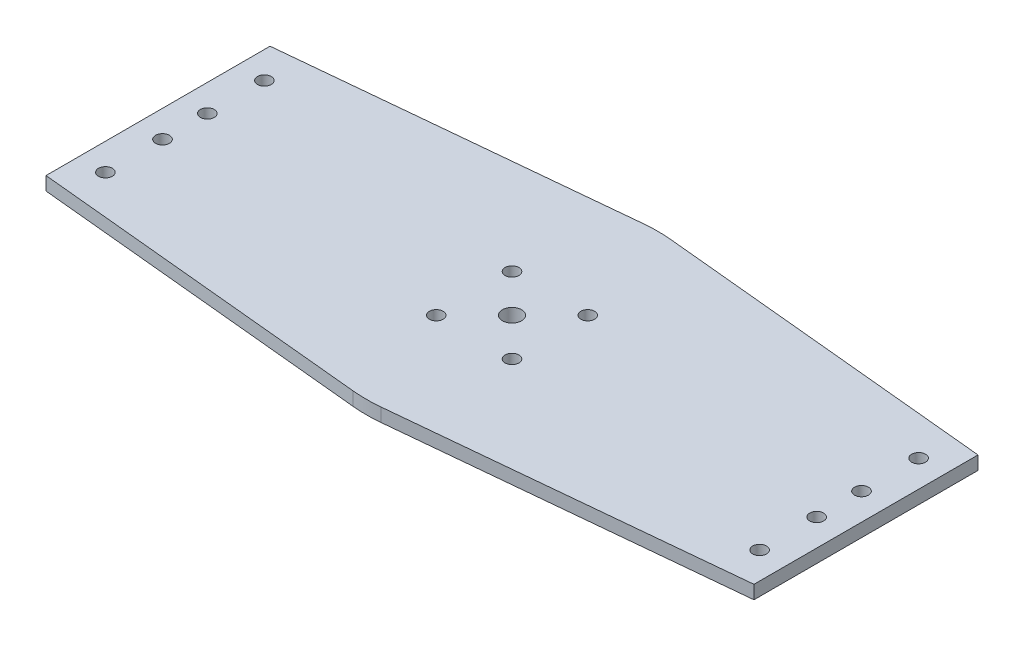
ISO-10303-21;
HEADER;
FILE_DESCRIPTION(('STEP AP214'),'2;1');
FILE_NAME('part.step','',(''),(''),'','','');
FILE_SCHEMA(('AUTOMOTIVE_DESIGN { 1 0 10303 214 1 1 1 1 }'));
ENDSEC;
DATA;
#1=APPLICATION_CONTEXT('core data for automotive mechanical design processes');
#2=APPLICATION_PROTOCOL_DEFINITION('international standard','automotive_design',2000,#1);
#3=PRODUCT_CONTEXT('',#1,'mechanical');
#4=PRODUCT('Part','Part','',(#3));
#5=PRODUCT_RELATED_PRODUCT_CATEGORY('part','',(#4));
#6=PRODUCT_DEFINITION_FORMATION('','',#4);
#7=PRODUCT_DEFINITION_CONTEXT('part definition',#1,'design');
#8=PRODUCT_DEFINITION('design','',#6,#7);
#9=PRODUCT_DEFINITION_SHAPE('','',#8);
#10=(LENGTH_UNIT() NAMED_UNIT(*) SI_UNIT(.MILLI.,.METRE.));
#11=(NAMED_UNIT(*) PLANE_ANGLE_UNIT() SI_UNIT($,.RADIAN.));
#12=(NAMED_UNIT(*) SI_UNIT($,.STERADIAN.) SOLID_ANGLE_UNIT());
#13=UNCERTAINTY_MEASURE_WITH_UNIT(LENGTH_MEASURE(1.E-05),#10,'distance_accuracy_value','');
#14=(GEOMETRIC_REPRESENTATION_CONTEXT(3) GLOBAL_UNCERTAINTY_ASSIGNED_CONTEXT((#13)) GLOBAL_UNIT_ASSIGNED_CONTEXT((#10,
#11,#12)) REPRESENTATION_CONTEXT('',''));
#15=CARTESIAN_POINT('',(0.,0.,0.));
#16=DIRECTION('',(0.,0.,1.));
#17=DIRECTION('',(1.,0.,0.));
#18=AXIS2_PLACEMENT_3D('',#15,#16,#17);
#19=CARTESIAN_POINT('',(0.,3.,0.));
#20=DIRECTION('',(0.,-1.,0.));
#21=DIRECTION('',(0.,0.,-1.));
#22=AXIS2_PLACEMENT_3D('',#19,#20,#21);
#23=CYLINDRICAL_SURFACE('',#22,32.5);
#24=CARTESIAN_POINT('',(0.,0.,0.));
#25=DIRECTION('',(0.,1.,0.));
#26=DIRECTION('',(0.,0.,1.));
#27=AXIS2_PLACEMENT_3D('',#24,#25,#26);
#28=CIRCLE('',#27,32.5);
#29=CARTESIAN_POINT('',(3.13335358237981,0.,-32.3486026796798));
#30=VERTEX_POINT('',#29);
#31=CARTESIAN_POINT('',(-3.13335358237981,0.,-32.3486026796798));
#32=VERTEX_POINT('',#31);
#33=EDGE_CURVE('E130',#30,#32,#28,.T.);
#34=ORIENTED_EDGE('',*,*,#33,.T.);
#35=DIRECTION('',(0.,-1.,0.));
#36=VECTOR('',#35,1.);
#37=CARTESIAN_POINT('',(-3.13335358237981,3.,-32.3486026796798));
#38=LINE('',#37,#36);
#39=CARTESIAN_POINT('',(-3.13335358237981,3.,-32.3486026796798));
#40=VERTEX_POINT('',#39);
#41=EDGE_CURVE('E11',#40,#32,#38,.T.);
#42=ORIENTED_EDGE('',*,*,#41,.F.);
#43=CARTESIAN_POINT('',(0.,3.,0.));
#44=DIRECTION('',(0.,1.,0.));
#45=DIRECTION('',(0.,0.,1.));
#46=AXIS2_PLACEMENT_3D('',#43,#44,#45);
#47=CIRCLE('',#46,32.5);
#48=CARTESIAN_POINT('',(3.13335358237981,3.,-32.3486026796798));
#49=VERTEX_POINT('',#48);
#50=EDGE_CURVE('E145',#49,#40,#47,.T.);
#51=ORIENTED_EDGE('',*,*,#50,.F.);
#52=DIRECTION('',(0.,-1.,0.));
#53=VECTOR('',#52,1.);
#54=CARTESIAN_POINT('',(3.13335358237981,3.,-32.3486026796798));
#55=LINE('',#54,#53);
#56=EDGE_CURVE('E126',#49,#30,#55,.T.);
#57=ORIENTED_EDGE('',*,*,#56,.T.);
#58=EDGE_LOOP('',(#34,#42,#51,#57));
#59=FACE_BOUND('',#58,.T.);
#60=ADVANCED_FACE('F34',(#59),#23,.T.);
#61=CARTESIAN_POINT('',(-79.,3.,-25.));
#62=DIRECTION('',(0.0964108794578403,0.,0.995341620913225));
#63=DIRECTION('',(0.995341620913225,0.,-0.0964108794578403));
#64=AXIS2_PLACEMENT_3D('',#61,#62,#63);
#65=PLANE('',#64);
#66=DIRECTION('',(-0.995341620913225,0.,0.0964108794578404));
#67=VECTOR('',#66,1.);
#68=CARTESIAN_POINT('',(-79.,0.,-25.));
#69=LINE('',#68,#67);
#70=CARTESIAN_POINT('',(-79.,0.,-25.));
#71=VERTEX_POINT('',#70);
#72=EDGE_CURVE('E133',#32,#71,#69,.T.);
#73=ORIENTED_EDGE('',*,*,#72,.T.);
#74=DIRECTION('',(0.,-1.,0.));
#75=VECTOR('',#74,1.);
#76=CARTESIAN_POINT('',(-79.,3.,-25.));
#77=LINE('',#76,#75);
#78=CARTESIAN_POINT('',(-79.,3.,-25.));
#79=VERTEX_POINT('',#78);
#80=EDGE_CURVE('E42',#79,#71,#77,.T.);
#81=ORIENTED_EDGE('',*,*,#80,.F.);
#82=DIRECTION('',(-0.995341620913225,0.,0.0964108794578404));
#83=VECTOR('',#82,1.);
#84=CARTESIAN_POINT('',(-79.,3.,-25.));
#85=LINE('',#84,#83);
#86=EDGE_CURVE('E93',#40,#79,#85,.T.);
#87=ORIENTED_EDGE('',*,*,#86,.F.);
#88=ORIENTED_EDGE('',*,*,#41,.T.);
#89=EDGE_LOOP('',(#73,#81,#87,#88));
#90=FACE_BOUND('',#89,.T.);
#91=ADVANCED_FACE('F271',(#90),#65,.F.);
#92=CARTESIAN_POINT('',(-79.,3.,-25.));
#93=DIRECTION('',(1.,0.,0.));
#94=DIRECTION('',(0.,0.,-1.));
#95=AXIS2_PLACEMENT_3D('',#92,#93,#94);
#96=PLANE('',#95);
#97=DIRECTION('',(0.,0.,1.));
#98=VECTOR('',#97,1.);
#99=CARTESIAN_POINT('',(-79.,0.,-25.));
#100=LINE('',#99,#98);
#101=CARTESIAN_POINT('',(-79.,0.,25.));
#102=VERTEX_POINT('',#101);
#103=EDGE_CURVE('E136',#71,#102,#100,.T.);
#104=ORIENTED_EDGE('',*,*,#103,.T.);
#105=DIRECTION('',(0.,-1.,0.));
#106=VECTOR('',#105,1.);
#107=CARTESIAN_POINT('',(-79.,3.,25.));
#108=LINE('',#107,#106);
#109=CARTESIAN_POINT('',(-79.,3.,25.));
#110=VERTEX_POINT('',#109);
#111=EDGE_CURVE('E152',#110,#102,#108,.T.);
#112=ORIENTED_EDGE('',*,*,#111,.F.);
#113=DIRECTION('',(0.,0.,1.));
#114=VECTOR('',#113,1.);
#115=CARTESIAN_POINT('',(-79.,3.,-25.));
#116=LINE('',#115,#114);
#117=EDGE_CURVE('E160',#79,#110,#116,.T.);
#118=ORIENTED_EDGE('',*,*,#117,.F.);
#119=ORIENTED_EDGE('',*,*,#80,.T.);
#120=EDGE_LOOP('',(#104,#112,#118,#119));
#121=FACE_BOUND('',#120,.T.);
#122=ADVANCED_FACE('F158',(#121),#96,.F.);
#123=CARTESIAN_POINT('',(-79.,3.,25.));
#124=DIRECTION('',(0.0964108794578402,0.,-0.995341620913225));
#125=DIRECTION('',(-0.995341620913225,0.,-0.0964108794578402));
#126=AXIS2_PLACEMENT_3D('',#123,#124,#125);
#127=PLANE('',#126);
#128=DIRECTION('',(0.995341620913225,0.,0.0964108794578402));
#129=VECTOR('',#128,1.);
#130=CARTESIAN_POINT('',(-79.,0.,25.));
#131=LINE('',#130,#129);
#132=CARTESIAN_POINT('',(-3.13335358237981,0.,32.3486026796798));
#133=VERTEX_POINT('',#132);
#134=EDGE_CURVE('E138',#102,#133,#131,.T.);
#135=ORIENTED_EDGE('',*,*,#134,.T.);
#136=DIRECTION('',(0.,-1.,0.));
#137=VECTOR('',#136,1.);
#138=CARTESIAN_POINT('',(-3.13335358237981,3.,32.3486026796798));
#139=LINE('',#138,#137);
#140=CARTESIAN_POINT('',(-3.13335358237981,3.,32.3486026796798));
#141=VERTEX_POINT('',#140);
#142=EDGE_CURVE('E149',#141,#133,#139,.T.);
#143=ORIENTED_EDGE('',*,*,#142,.F.);
#144=DIRECTION('',(0.995341620913225,0.,0.0964108794578402));
#145=VECTOR('',#144,1.);
#146=CARTESIAN_POINT('',(-79.,3.,25.));
#147=LINE('',#146,#145);
#148=EDGE_CURVE('E172',#110,#141,#147,.T.);
#149=ORIENTED_EDGE('',*,*,#148,.F.);
#150=ORIENTED_EDGE('',*,*,#111,.T.);
#151=EDGE_LOOP('',(#135,#143,#149,#150));
#152=FACE_BOUND('',#151,.T.);
#153=ADVANCED_FACE('F168',(#152),#127,.F.);
#154=CARTESIAN_POINT('',(0.,3.,0.));
#155=DIRECTION('',(0.,-1.,0.));
#156=DIRECTION('',(0.,0.,-1.));
#157=AXIS2_PLACEMENT_3D('',#154,#155,#156);
#158=CYLINDRICAL_SURFACE('',#157,32.5);
#159=CARTESIAN_POINT('',(0.,0.,0.));
#160=DIRECTION('',(0.,1.,0.));
#161=DIRECTION('',(0.,0.,1.));
#162=AXIS2_PLACEMENT_3D('',#159,#160,#161);
#163=CIRCLE('',#162,32.5);
#164=CARTESIAN_POINT('',(3.1333535823798,0.,32.3486026796798));
#165=VERTEX_POINT('',#164);
#166=EDGE_CURVE('E140',#133,#165,#163,.T.);
#167=ORIENTED_EDGE('',*,*,#166,.T.);
#168=DIRECTION('',(0.,-1.,0.));
#169=VECTOR('',#168,1.);
#170=CARTESIAN_POINT('',(3.1333535823798,3.,32.3486026796798));
#171=LINE('',#170,#169);
#172=CARTESIAN_POINT('',(3.1333535823798,3.,32.3486026796798));
#173=VERTEX_POINT('',#172);
#174=EDGE_CURVE('E121',#173,#165,#171,.T.);
#175=ORIENTED_EDGE('',*,*,#174,.F.);
#176=CARTESIAN_POINT('',(0.,3.,0.));
#177=DIRECTION('',(0.,1.,0.));
#178=DIRECTION('',(0.,0.,1.));
#179=AXIS2_PLACEMENT_3D('',#176,#177,#178);
#180=CIRCLE('',#179,32.5);
#181=EDGE_CURVE('E112',#141,#173,#180,.T.);
#182=ORIENTED_EDGE('',*,*,#181,.F.);
#183=ORIENTED_EDGE('',*,*,#142,.T.);
#184=EDGE_LOOP('',(#167,#175,#182,#183));
#185=FACE_BOUND('',#184,.T.);
#186=ADVANCED_FACE('F171',(#185),#158,.T.);
#187=CARTESIAN_POINT('',(79.,3.,25.));
#188=DIRECTION('',(-0.0964108794578402,0.,-0.995341620913225));
#189=DIRECTION('',(-0.995341620913225,0.,0.0964108794578402));
#190=AXIS2_PLACEMENT_3D('',#187,#188,#189);
#191=PLANE('',#190);
#192=DIRECTION('',(0.995341620913225,0.,-0.0964108794578402));
#193=VECTOR('',#192,1.);
#194=CARTESIAN_POINT('',(79.,0.,25.));
#195=LINE('',#194,#193);
#196=CARTESIAN_POINT('',(79.,0.,25.));
#197=VERTEX_POINT('',#196);
#198=EDGE_CURVE('E120',#165,#197,#195,.T.);
#199=ORIENTED_EDGE('',*,*,#198,.T.);
#200=DIRECTION('',(0.,-1.,0.));
#201=VECTOR('',#200,1.);
#202=CARTESIAN_POINT('',(79.,3.,25.));
#203=LINE('',#202,#201);
#204=CARTESIAN_POINT('',(79.,3.,25.));
#205=VERTEX_POINT('',#204);
#206=EDGE_CURVE('E117',#205,#197,#203,.T.);
#207=ORIENTED_EDGE('',*,*,#206,.F.);
#208=DIRECTION('',(0.995341620913225,0.,-0.0964108794578402));
#209=VECTOR('',#208,1.);
#210=CARTESIAN_POINT('',(79.,3.,25.));
#211=LINE('',#210,#209);
#212=EDGE_CURVE('E106',#173,#205,#211,.T.);
#213=ORIENTED_EDGE('',*,*,#212,.F.);
#214=ORIENTED_EDGE('',*,*,#174,.T.);
#215=EDGE_LOOP('',(#199,#207,#213,#214));
#216=FACE_BOUND('',#215,.T.);
#217=ADVANCED_FACE('F118',(#216),#191,.F.);
#218=CARTESIAN_POINT('',(79.,3.,-25.));
#219=DIRECTION('',(-1.,0.,0.));
#220=DIRECTION('',(0.,0.,1.));
#221=AXIS2_PLACEMENT_3D('',#218,#219,#220);
#222=PLANE('',#221);
#223=DIRECTION('',(0.,0.,-1.));
#224=VECTOR('',#223,1.);
#225=CARTESIAN_POINT('',(79.,0.,-25.));
#226=LINE('',#225,#224);
#227=CARTESIAN_POINT('',(79.,0.,-25.));
#228=VERTEX_POINT('',#227);
#229=EDGE_CURVE('E79',#197,#228,#226,.T.);
#230=ORIENTED_EDGE('',*,*,#229,.T.);
#231=DIRECTION('',(0.,-1.,0.));
#232=VECTOR('',#231,1.);
#233=CARTESIAN_POINT('',(79.,3.,-25.));
#234=LINE('',#233,#232);
#235=CARTESIAN_POINT('',(79.,3.,-25.));
#236=VERTEX_POINT('',#235);
#237=EDGE_CURVE('E122',#236,#228,#234,.T.);
#238=ORIENTED_EDGE('',*,*,#237,.F.);
#239=DIRECTION('',(0.,0.,-1.));
#240=VECTOR('',#239,1.);
#241=CARTESIAN_POINT('',(79.,3.,-25.));
#242=LINE('',#241,#240);
#243=EDGE_CURVE('E110',#205,#236,#242,.T.);
#244=ORIENTED_EDGE('',*,*,#243,.F.);
#245=ORIENTED_EDGE('',*,*,#206,.T.);
#246=EDGE_LOOP('',(#230,#238,#244,#245));
#247=FACE_BOUND('',#246,.T.);
#248=ADVANCED_FACE('F124',(#247),#222,.F.);
#249=CARTESIAN_POINT('',(79.,3.,-25.));
#250=DIRECTION('',(-0.0964108794578402,0.,0.995341620913225));
#251=DIRECTION('',(0.995341620913225,0.,0.0964108794578402));
#252=AXIS2_PLACEMENT_3D('',#249,#250,#251);
#253=PLANE('',#252);
#254=DIRECTION('',(-0.995341620913225,0.,-0.0964108794578403));
#255=VECTOR('',#254,1.);
#256=CARTESIAN_POINT('',(79.,0.,-25.));
#257=LINE('',#256,#255);
#258=EDGE_CURVE('E85',#228,#30,#257,.T.);
#259=ORIENTED_EDGE('',*,*,#258,.T.);
#260=ORIENTED_EDGE('',*,*,#56,.F.);
#261=DIRECTION('',(-0.995341620913225,0.,-0.0964108794578403));
#262=VECTOR('',#261,1.);
#263=CARTESIAN_POINT('',(79.,3.,-25.));
#264=LINE('',#263,#262);
#265=EDGE_CURVE('E50',#236,#49,#264,.T.);
#266=ORIENTED_EDGE('',*,*,#265,.F.);
#267=ORIENTED_EDGE('',*,*,#237,.T.);
#268=EDGE_LOOP('',(#259,#260,#266,#267));
#269=FACE_BOUND('',#268,.T.);
#270=ADVANCED_FACE('F278',(#269),#253,.F.);
#271=CARTESIAN_POINT('',(0.,3.,0.));
#272=DIRECTION('',(0.,1.,0.));
#273=DIRECTION('',(0.,0.,1.));
#274=AXIS2_PLACEMENT_3D('',#271,#272,#273);
#275=PLANE('',#274);
#276=CARTESIAN_POINT('',(73.,3.,5.));
#277=DIRECTION('',(0.,1.,0.));
#278=DIRECTION('',(0.,0.,1.));
#279=AXIS2_PLACEMENT_3D('',#276,#277,#278);
#280=CIRCLE('',#279,1.54999999999999);
#281=CARTESIAN_POINT('',(73.,3.,6.55));
#282=VERTEX_POINT('',#281);
#283=EDGE_CURVE('E237',#282,#282,#280,.F.);
#284=ORIENTED_EDGE('',*,*,#283,.T.);
#285=EDGE_LOOP('',(#284));
#286=FACE_BOUND('',#285,.T.);
#287=CARTESIAN_POINT('',(73.,3.,-5.));
#288=DIRECTION('',(0.,1.,0.));
#289=DIRECTION('',(0.,0.,1.));
#290=AXIS2_PLACEMENT_3D('',#287,#288,#289);
#291=CIRCLE('',#290,1.54999999999999);
#292=CARTESIAN_POINT('',(73.,3.,-3.45000000000001));
#293=VERTEX_POINT('',#292);
#294=EDGE_CURVE('E240',#293,#293,#291,.F.);
#295=ORIENTED_EDGE('',*,*,#294,.T.);
#296=EDGE_LOOP('',(#295));
#297=FACE_BOUND('',#296,.T.);
#298=CARTESIAN_POINT('',(73.,3.,-17.74));
#299=DIRECTION('',(0.,1.,0.));
#300=DIRECTION('',(0.,0.,1.));
#301=AXIS2_PLACEMENT_3D('',#298,#299,#300);
#302=CIRCLE('',#301,1.54999999999999);
#303=CARTESIAN_POINT('',(73.,3.,-16.19));
#304=VERTEX_POINT('',#303);
#305=EDGE_CURVE('E243',#304,#304,#302,.F.);
#306=ORIENTED_EDGE('',*,*,#305,.T.);
#307=EDGE_LOOP('',(#306));
#308=FACE_BOUND('',#307,.T.);
#309=CARTESIAN_POINT('',(73.,3.,17.74));
#310=DIRECTION('',(0.,1.,0.));
#311=DIRECTION('',(0.,0.,1.));
#312=AXIS2_PLACEMENT_3D('',#309,#310,#311);
#313=CIRCLE('',#312,1.54999999999999);
#314=CARTESIAN_POINT('',(73.,3.,19.29));
#315=VERTEX_POINT('',#314);
#316=EDGE_CURVE('E227',#315,#315,#313,.F.);
#317=ORIENTED_EDGE('',*,*,#316,.T.);
#318=EDGE_LOOP('',(#317));
#319=FACE_BOUND('',#318,.T.);
#320=CARTESIAN_POINT('',(-73.,3.,5.));
#321=DIRECTION('',(0.,1.,0.));
#322=DIRECTION('',(0.,0.,1.));
#323=AXIS2_PLACEMENT_3D('',#320,#321,#322);
#324=CIRCLE('',#323,1.54999999999999);
#325=CARTESIAN_POINT('',(-73.,3.,6.55));
#326=VERTEX_POINT('',#325);
#327=EDGE_CURVE('E213',#326,#326,#324,.T.);
#328=ORIENTED_EDGE('',*,*,#327,.F.);
#329=EDGE_LOOP('',(#328));
#330=FACE_BOUND('',#329,.T.);
#331=CARTESIAN_POINT('',(-73.,3.,-5.));
#332=DIRECTION('',(0.,1.,0.));
#333=DIRECTION('',(0.,0.,1.));
#334=AXIS2_PLACEMENT_3D('',#331,#332,#333);
#335=CIRCLE('',#334,1.54999999999999);
#336=CARTESIAN_POINT('',(-73.,3.,-3.45000000000001));
#337=VERTEX_POINT('',#336);
#338=EDGE_CURVE('E216',#337,#337,#335,.T.);
#339=ORIENTED_EDGE('',*,*,#338,.F.);
#340=EDGE_LOOP('',(#339));
#341=FACE_BOUND('',#340,.T.);
#342=CARTESIAN_POINT('',(-73.,3.,-17.74));
#343=DIRECTION('',(0.,1.,0.));
#344=DIRECTION('',(0.,0.,1.));
#345=AXIS2_PLACEMENT_3D('',#342,#343,#344);
#346=CIRCLE('',#345,1.54999999999999);
#347=CARTESIAN_POINT('',(-73.,3.,-16.19));
#348=VERTEX_POINT('',#347);
#349=EDGE_CURVE('E219',#348,#348,#346,.T.);
#350=ORIENTED_EDGE('',*,*,#349,.F.);
#351=EDGE_LOOP('',(#350));
#352=FACE_BOUND('',#351,.T.);
#353=CARTESIAN_POINT('',(-73.,3.,17.74));
#354=DIRECTION('',(0.,1.,0.));
#355=DIRECTION('',(0.,0.,1.));
#356=AXIS2_PLACEMENT_3D('',#353,#354,#355);
#357=CIRCLE('',#356,1.54999999999999);
#358=CARTESIAN_POINT('',(-73.,3.,19.29));
#359=VERTEX_POINT('',#358);
#360=EDGE_CURVE('E188',#359,#359,#357,.T.);
#361=ORIENTED_EDGE('',*,*,#360,.F.);
#362=EDGE_LOOP('',(#361));
#363=FACE_BOUND('',#362,.T.);
#364=CARTESIAN_POINT('',(8.45,3.,-8.45));
#365=DIRECTION('',(0.,1.,0.));
#366=DIRECTION('',(0.,0.,1.));
#367=AXIS2_PLACEMENT_3D('',#364,#365,#366);
#368=CIRCLE('',#367,1.55);
#369=CARTESIAN_POINT('',(8.45,3.,-6.9));
#370=VERTEX_POINT('',#369);
#371=EDGE_CURVE('E203',#370,#370,#368,.T.);
#372=ORIENTED_EDGE('',*,*,#371,.F.);
#373=EDGE_LOOP('',(#372));
#374=FACE_BOUND('',#373,.T.);
#375=CARTESIAN_POINT('',(8.45,3.,8.45));
#376=DIRECTION('',(0.,1.,0.));
#377=DIRECTION('',(0.,0.,1.));
#378=AXIS2_PLACEMENT_3D('',#375,#376,#377);
#379=CIRCLE('',#378,1.55);
#380=CARTESIAN_POINT('',(8.45,3.,9.99999999999999));
#381=VERTEX_POINT('',#380);
#382=EDGE_CURVE('E197',#381,#381,#379,.T.);
#383=ORIENTED_EDGE('',*,*,#382,.F.);
#384=EDGE_LOOP('',(#383));
#385=FACE_BOUND('',#384,.T.);
#386=CARTESIAN_POINT('',(-8.45,3.,8.45));
#387=DIRECTION('',(0.,1.,0.));
#388=DIRECTION('',(0.,0.,1.));
#389=AXIS2_PLACEMENT_3D('',#386,#387,#388);
#390=CIRCLE('',#389,1.55);
#391=CARTESIAN_POINT('',(-8.45,3.,10.));
#392=VERTEX_POINT('',#391);
#393=EDGE_CURVE('E191',#392,#392,#390,.T.);
#394=ORIENTED_EDGE('',*,*,#393,.F.);
#395=EDGE_LOOP('',(#394));
#396=FACE_BOUND('',#395,.T.);
#397=CARTESIAN_POINT('',(0.,3.,0.));
#398=DIRECTION('',(0.,1.,0.));
#399=DIRECTION('',(0.,0.,1.));
#400=AXIS2_PLACEMENT_3D('',#397,#398,#399);
#401=CIRCLE('',#400,2.15);
#402=CARTESIAN_POINT('',(0.,3.,2.14999999999999));
#403=VERTEX_POINT('',#402);
#404=EDGE_CURVE('E184',#403,#403,#401,.T.);
#405=ORIENTED_EDGE('',*,*,#404,.F.);
#406=EDGE_LOOP('',(#405));
#407=FACE_BOUND('',#406,.T.);
#408=CARTESIAN_POINT('',(-8.45,3.,-8.45));
#409=DIRECTION('',(0.,1.,0.));
#410=DIRECTION('',(0.,0.,1.));
#411=AXIS2_PLACEMENT_3D('',#408,#409,#410);
#412=CIRCLE('',#411,1.55);
#413=CARTESIAN_POINT('',(-8.45,3.,-6.9));
#414=VERTEX_POINT('',#413);
#415=EDGE_CURVE('E178',#414,#414,#412,.T.);
#416=ORIENTED_EDGE('',*,*,#415,.F.);
#417=EDGE_LOOP('',(#416));
#418=FACE_BOUND('',#417,.T.);
#419=ORIENTED_EDGE('',*,*,#50,.T.);
#420=ORIENTED_EDGE('',*,*,#86,.T.);
#421=ORIENTED_EDGE('',*,*,#117,.T.);
#422=ORIENTED_EDGE('',*,*,#148,.T.);
#423=ORIENTED_EDGE('',*,*,#181,.T.);
#424=ORIENTED_EDGE('',*,*,#212,.T.);
#425=ORIENTED_EDGE('',*,*,#243,.T.);
#426=ORIENTED_EDGE('',*,*,#265,.T.);
#427=EDGE_LOOP('',(#419,#420,#421,#422,#423,#424,#425,#426));
#428=FACE_BOUND('',#427,.T.);
#429=ADVANCED_FACE('F108',(#286,#297,#308,#319,#330,#341,#352,#363,#374,#385,#396,#407,#418,
#428),#275,.T.);
#430=CARTESIAN_POINT('',(0.,0.,0.));
#431=DIRECTION('',(0.,1.,0.));
#432=DIRECTION('',(0.,0.,1.));
#433=AXIS2_PLACEMENT_3D('',#430,#431,#432);
#434=PLANE('',#433);
#435=CARTESIAN_POINT('',(73.,0.,5.));
#436=DIRECTION('',(0.,1.,0.));
#437=DIRECTION('',(0.,0.,-1.));
#438=AXIS2_PLACEMENT_3D('',#435,#436,#437);
#439=CIRCLE('',#438,1.54999999999999);
#440=CARTESIAN_POINT('',(73.,0.,3.45000000000001));
#441=VERTEX_POINT('',#440);
#442=EDGE_CURVE('E246',#441,#441,#439,.T.);
#443=ORIENTED_EDGE('',*,*,#442,.T.);
#444=EDGE_LOOP('',(#443));
#445=FACE_BOUND('',#444,.T.);
#446=CARTESIAN_POINT('',(73.,0.,-5.));
#447=DIRECTION('',(0.,1.,0.));
#448=DIRECTION('',(0.,0.,-1.));
#449=AXIS2_PLACEMENT_3D('',#446,#447,#448);
#450=CIRCLE('',#449,1.54999999999999);
#451=CARTESIAN_POINT('',(73.,0.,-6.54999999999999));
#452=VERTEX_POINT('',#451);
#453=EDGE_CURVE('E250',#452,#452,#450,.T.);
#454=ORIENTED_EDGE('',*,*,#453,.T.);
#455=EDGE_LOOP('',(#454));
#456=FACE_BOUND('',#455,.T.);
#457=CARTESIAN_POINT('',(73.,0.,-17.74));
#458=DIRECTION('',(0.,1.,0.));
#459=DIRECTION('',(0.,0.,-1.));
#460=AXIS2_PLACEMENT_3D('',#457,#458,#459);
#461=CIRCLE('',#460,1.54999999999999);
#462=CARTESIAN_POINT('',(73.,0.,-19.29));
#463=VERTEX_POINT('',#462);
#464=EDGE_CURVE('E247',#463,#463,#461,.T.);
#465=ORIENTED_EDGE('',*,*,#464,.T.);
#466=EDGE_LOOP('',(#465));
#467=FACE_BOUND('',#466,.T.);
#468=CARTESIAN_POINT('',(73.,0.,17.74));
#469=DIRECTION('',(0.,1.,0.));
#470=DIRECTION('',(0.,0.,-1.));
#471=AXIS2_PLACEMENT_3D('',#468,#469,#470);
#472=CIRCLE('',#471,1.54999999999999);
#473=CARTESIAN_POINT('',(73.,0.,16.19));
#474=VERTEX_POINT('',#473);
#475=EDGE_CURVE('E234',#474,#474,#472,.T.);
#476=ORIENTED_EDGE('',*,*,#475,.T.);
#477=EDGE_LOOP('',(#476));
#478=FACE_BOUND('',#477,.T.);
#479=CARTESIAN_POINT('',(-73.,0.,5.));
#480=DIRECTION('',(0.,-1.,0.));
#481=DIRECTION('',(0.,0.,-1.));
#482=AXIS2_PLACEMENT_3D('',#479,#480,#481);
#483=CIRCLE('',#482,1.54999999999999);
#484=CARTESIAN_POINT('',(-73.,0.,3.45000000000001));
#485=VERTEX_POINT('',#484);
#486=EDGE_CURVE('E222',#485,#485,#483,.T.);
#487=ORIENTED_EDGE('',*,*,#486,.F.);
#488=EDGE_LOOP('',(#487));
#489=FACE_BOUND('',#488,.T.);
#490=CARTESIAN_POINT('',(-73.,0.,-5.));
#491=DIRECTION('',(0.,-1.,0.));
#492=DIRECTION('',(0.,0.,-1.));
#493=AXIS2_PLACEMENT_3D('',#490,#491,#492);
#494=CIRCLE('',#493,1.54999999999999);
#495=CARTESIAN_POINT('',(-73.,0.,-6.54999999999999));
#496=VERTEX_POINT('',#495);
#497=EDGE_CURVE('E226',#496,#496,#494,.T.);
#498=ORIENTED_EDGE('',*,*,#497,.F.);
#499=EDGE_LOOP('',(#498));
#500=FACE_BOUND('',#499,.T.);
#501=CARTESIAN_POINT('',(-73.,0.,-17.74));
#502=DIRECTION('',(0.,-1.,0.));
#503=DIRECTION('',(0.,0.,-1.));
#504=AXIS2_PLACEMENT_3D('',#501,#502,#503);
#505=CIRCLE('',#504,1.54999999999999);
#506=CARTESIAN_POINT('',(-73.,0.,-19.29));
#507=VERTEX_POINT('',#506);
#508=EDGE_CURVE('E223',#507,#507,#505,.T.);
#509=ORIENTED_EDGE('',*,*,#508,.F.);
#510=EDGE_LOOP('',(#509));
#511=FACE_BOUND('',#510,.T.);
#512=CARTESIAN_POINT('',(-73.,0.,17.74));
#513=DIRECTION('',(0.,-1.,0.));
#514=DIRECTION('',(0.,0.,-1.));
#515=AXIS2_PLACEMENT_3D('',#512,#513,#514);
#516=CIRCLE('',#515,1.54999999999999);
#517=CARTESIAN_POINT('',(-73.,0.,16.19));
#518=VERTEX_POINT('',#517);
#519=EDGE_CURVE('E210',#518,#518,#516,.T.);
#520=ORIENTED_EDGE('',*,*,#519,.F.);
#521=EDGE_LOOP('',(#520));
#522=FACE_BOUND('',#521,.T.);
#523=CARTESIAN_POINT('',(8.45,0.,-8.45));
#524=DIRECTION('',(0.,1.,0.));
#525=DIRECTION('',(0.,0.,1.));
#526=AXIS2_PLACEMENT_3D('',#523,#524,#525);
#527=CIRCLE('',#526,1.55);
#528=CARTESIAN_POINT('',(8.45,0.,-6.9));
#529=VERTEX_POINT('',#528);
#530=EDGE_CURVE('E181',#529,#529,#527,.T.);
#531=ORIENTED_EDGE('',*,*,#530,.T.);
#532=EDGE_LOOP('',(#531));
#533=FACE_BOUND('',#532,.T.);
#534=CARTESIAN_POINT('',(8.45,0.,8.45));
#535=DIRECTION('',(0.,1.,0.));
#536=DIRECTION('',(0.,0.,1.));
#537=AXIS2_PLACEMENT_3D('',#534,#535,#536);
#538=CIRCLE('',#537,1.55);
#539=CARTESIAN_POINT('',(8.45,0.,9.99999999999999));
#540=VERTEX_POINT('',#539);
#541=EDGE_CURVE('E200',#540,#540,#538,.T.);
#542=ORIENTED_EDGE('',*,*,#541,.T.);
#543=EDGE_LOOP('',(#542));
#544=FACE_BOUND('',#543,.T.);
#545=CARTESIAN_POINT('',(-8.45,0.,8.45));
#546=DIRECTION('',(0.,1.,0.));
#547=DIRECTION('',(0.,0.,1.));
#548=AXIS2_PLACEMENT_3D('',#545,#546,#547);
#549=CIRCLE('',#548,1.55);
#550=CARTESIAN_POINT('',(-8.45,0.,10.));
#551=VERTEX_POINT('',#550);
#552=EDGE_CURVE('E194',#551,#551,#549,.T.);
#553=ORIENTED_EDGE('',*,*,#552,.T.);
#554=EDGE_LOOP('',(#553));
#555=FACE_BOUND('',#554,.T.);
#556=CARTESIAN_POINT('',(0.,0.,0.));
#557=DIRECTION('',(0.,1.,0.));
#558=DIRECTION('',(0.,0.,1.));
#559=AXIS2_PLACEMENT_3D('',#556,#557,#558);
#560=CIRCLE('',#559,2.15);
#561=CARTESIAN_POINT('',(0.,0.,2.14999999999999));
#562=VERTEX_POINT('',#561);
#563=EDGE_CURVE('E187',#562,#562,#560,.T.);
#564=ORIENTED_EDGE('',*,*,#563,.T.);
#565=EDGE_LOOP('',(#564));
#566=FACE_BOUND('',#565,.T.);
#567=CARTESIAN_POINT('',(-8.45,0.,-8.45));
#568=DIRECTION('',(0.,1.,0.));
#569=DIRECTION('',(0.,0.,1.));
#570=AXIS2_PLACEMENT_3D('',#567,#568,#569);
#571=CIRCLE('',#570,1.55);
#572=CARTESIAN_POINT('',(-8.45,0.,-6.9));
#573=VERTEX_POINT('',#572);
#574=EDGE_CURVE('E134',#573,#573,#571,.T.);
#575=ORIENTED_EDGE('',*,*,#574,.T.);
#576=EDGE_LOOP('',(#575));
#577=FACE_BOUND('',#576,.T.);
#578=ORIENTED_EDGE('',*,*,#33,.F.);
#579=ORIENTED_EDGE('',*,*,#258,.F.);
#580=ORIENTED_EDGE('',*,*,#229,.F.);
#581=ORIENTED_EDGE('',*,*,#198,.F.);
#582=ORIENTED_EDGE('',*,*,#166,.F.);
#583=ORIENTED_EDGE('',*,*,#134,.F.);
#584=ORIENTED_EDGE('',*,*,#103,.F.);
#585=ORIENTED_EDGE('',*,*,#72,.F.);
#586=EDGE_LOOP('',(#578,#579,#580,#581,#582,#583,#584,#585));
#587=FACE_BOUND('',#586,.T.);
#588=ADVANCED_FACE('F164',(#445,#456,#467,#478,#489,#500,#511,#522,#533,#544,#555,#566,#577,
#587),#434,.F.);
#589=CARTESIAN_POINT('',(-8.45,0.,-8.45));
#590=DIRECTION('',(0.,1.,0.));
#591=DIRECTION('',(0.,0.,1.));
#592=AXIS2_PLACEMENT_3D('',#589,#590,#591);
#593=CYLINDRICAL_SURFACE('',#592,1.55);
#594=ORIENTED_EDGE('',*,*,#574,.F.);
#595=EDGE_LOOP('',(#594));
#596=FACE_BOUND('',#595,.T.);
#597=ORIENTED_EDGE('',*,*,#415,.T.);
#598=EDGE_LOOP('',(#597));
#599=FACE_BOUND('',#598,.T.);
#600=ADVANCED_FACE('F327',(#596,#599),#593,.F.);
#601=CARTESIAN_POINT('',(0.,0.,0.));
#602=DIRECTION('',(0.,1.,0.));
#603=DIRECTION('',(0.,0.,1.));
#604=AXIS2_PLACEMENT_3D('',#601,#602,#603);
#605=CYLINDRICAL_SURFACE('',#604,2.15);
#606=ORIENTED_EDGE('',*,*,#563,.F.);
#607=EDGE_LOOP('',(#606));
#608=FACE_BOUND('',#607,.T.);
#609=ORIENTED_EDGE('',*,*,#404,.T.);
#610=EDGE_LOOP('',(#609));
#611=FACE_BOUND('',#610,.T.);
#612=ADVANCED_FACE('F332',(#608,#611),#605,.F.);
#613=CARTESIAN_POINT('',(-8.45,0.,8.45));
#614=DIRECTION('',(0.,1.,0.));
#615=DIRECTION('',(0.,0.,1.));
#616=AXIS2_PLACEMENT_3D('',#613,#614,#615);
#617=CYLINDRICAL_SURFACE('',#616,1.55);
#618=ORIENTED_EDGE('',*,*,#552,.F.);
#619=EDGE_LOOP('',(#618));
#620=FACE_BOUND('',#619,.T.);
#621=ORIENTED_EDGE('',*,*,#393,.T.);
#622=EDGE_LOOP('',(#621));
#623=FACE_BOUND('',#622,.T.);
#624=ADVANCED_FACE('F344',(#620,#623),#617,.F.);
#625=CARTESIAN_POINT('',(8.45,0.,8.45));
#626=DIRECTION('',(0.,1.,0.));
#627=DIRECTION('',(0.,0.,1.));
#628=AXIS2_PLACEMENT_3D('',#625,#626,#627);
#629=CYLINDRICAL_SURFACE('',#628,1.55);
#630=ORIENTED_EDGE('',*,*,#541,.F.);
#631=EDGE_LOOP('',(#630));
#632=FACE_BOUND('',#631,.T.);
#633=ORIENTED_EDGE('',*,*,#382,.T.);
#634=EDGE_LOOP('',(#633));
#635=FACE_BOUND('',#634,.T.);
#636=ADVANCED_FACE('F354',(#632,#635),#629,.F.);
#637=CARTESIAN_POINT('',(8.45,0.,-8.45));
#638=DIRECTION('',(0.,1.,0.));
#639=DIRECTION('',(0.,0.,1.));
#640=AXIS2_PLACEMENT_3D('',#637,#638,#639);
#641=CYLINDRICAL_SURFACE('',#640,1.55);
#642=ORIENTED_EDGE('',*,*,#530,.F.);
#643=EDGE_LOOP('',(#642));
#644=FACE_BOUND('',#643,.T.);
#645=ORIENTED_EDGE('',*,*,#371,.T.);
#646=EDGE_LOOP('',(#645));
#647=FACE_BOUND('',#646,.T.);
#648=ADVANCED_FACE('F364',(#644,#647),#641,.F.);
#649=CARTESIAN_POINT('',(-73.,4.,17.74));
#650=DIRECTION('',(0.,-1.,0.));
#651=DIRECTION('',(0.,0.,-1.));
#652=AXIS2_PLACEMENT_3D('',#649,#650,#651);
#653=CYLINDRICAL_SURFACE('',#652,1.54999999999999);
#654=ORIENTED_EDGE('',*,*,#360,.T.);
#655=EDGE_LOOP('',(#654));
#656=FACE_BOUND('',#655,.T.);
#657=ORIENTED_EDGE('',*,*,#519,.T.);
#658=EDGE_LOOP('',(#657));
#659=FACE_BOUND('',#658,.T.);
#660=ADVANCED_FACE('F374',(#656,#659),#653,.F.);
#661=CARTESIAN_POINT('',(-73.,4.,-17.74));
#662=DIRECTION('',(0.,-1.,0.));
#663=DIRECTION('',(0.,0.,-1.));
#664=AXIS2_PLACEMENT_3D('',#661,#662,#663);
#665=CYLINDRICAL_SURFACE('',#664,1.54999999999999);
#666=ORIENTED_EDGE('',*,*,#349,.T.);
#667=EDGE_LOOP('',(#666));
#668=FACE_BOUND('',#667,.T.);
#669=ORIENTED_EDGE('',*,*,#508,.T.);
#670=EDGE_LOOP('',(#669));
#671=FACE_BOUND('',#670,.T.);
#672=ADVANCED_FACE('F384',(#668,#671),#665,.F.);
#673=CARTESIAN_POINT('',(-73.,4.,-5.));
#674=DIRECTION('',(0.,-1.,0.));
#675=DIRECTION('',(0.,0.,-1.));
#676=AXIS2_PLACEMENT_3D('',#673,#674,#675);
#677=CYLINDRICAL_SURFACE('',#676,1.54999999999999);
#678=ORIENTED_EDGE('',*,*,#338,.T.);
#679=EDGE_LOOP('',(#678));
#680=FACE_BOUND('',#679,.T.);
#681=ORIENTED_EDGE('',*,*,#497,.T.);
#682=EDGE_LOOP('',(#681));
#683=FACE_BOUND('',#682,.T.);
#684=ADVANCED_FACE('F394',(#680,#683),#677,.F.);
#685=CARTESIAN_POINT('',(-73.,4.,5.));
#686=DIRECTION('',(0.,-1.,0.));
#687=DIRECTION('',(0.,0.,-1.));
#688=AXIS2_PLACEMENT_3D('',#685,#686,#687);
#689=CYLINDRICAL_SURFACE('',#688,1.54999999999999);
#690=ORIENTED_EDGE('',*,*,#327,.T.);
#691=EDGE_LOOP('',(#690));
#692=FACE_BOUND('',#691,.T.);
#693=ORIENTED_EDGE('',*,*,#486,.T.);
#694=EDGE_LOOP('',(#693));
#695=FACE_BOUND('',#694,.T.);
#696=ADVANCED_FACE('F404',(#692,#695),#689,.F.);
#697=CARTESIAN_POINT('',(73.,4.,17.74));
#698=DIRECTION('',(0.,-1.,0.));
#699=DIRECTION('',(0.,0.,-1.));
#700=AXIS2_PLACEMENT_3D('',#697,#698,#699);
#701=CYLINDRICAL_SURFACE('',#700,1.54999999999999);
#702=ORIENTED_EDGE('',*,*,#316,.F.);
#703=EDGE_LOOP('',(#702));
#704=FACE_BOUND('',#703,.T.);
#705=ORIENTED_EDGE('',*,*,#475,.F.);
#706=EDGE_LOOP('',(#705));
#707=FACE_BOUND('',#706,.T.);
#708=ADVANCED_FACE('F414',(#704,#707),#701,.F.);
#709=CARTESIAN_POINT('',(73.,4.,-17.74));
#710=DIRECTION('',(0.,-1.,0.));
#711=DIRECTION('',(0.,0.,-1.));
#712=AXIS2_PLACEMENT_3D('',#709,#710,#711);
#713=CYLINDRICAL_SURFACE('',#712,1.54999999999999);
#714=ORIENTED_EDGE('',*,*,#305,.F.);
#715=EDGE_LOOP('',(#714));
#716=FACE_BOUND('',#715,.T.);
#717=ORIENTED_EDGE('',*,*,#464,.F.);
#718=EDGE_LOOP('',(#717));
#719=FACE_BOUND('',#718,.T.);
#720=ADVANCED_FACE('F266',(#716,#719),#713,.F.);
#721=CARTESIAN_POINT('',(73.,4.,-5.));
#722=DIRECTION('',(0.,-1.,0.));
#723=DIRECTION('',(0.,0.,-1.));
#724=AXIS2_PLACEMENT_3D('',#721,#722,#723);
#725=CYLINDRICAL_SURFACE('',#724,1.54999999999999);
#726=ORIENTED_EDGE('',*,*,#294,.F.);
#727=EDGE_LOOP('',(#726));
#728=FACE_BOUND('',#727,.T.);
#729=ORIENTED_EDGE('',*,*,#453,.F.);
#730=EDGE_LOOP('',(#729));
#731=FACE_BOUND('',#730,.T.);
#732=ADVANCED_FACE('F260',(#728,#731),#725,.F.);
#733=CARTESIAN_POINT('',(73.,4.,5.));
#734=DIRECTION('',(0.,-1.,0.));
#735=DIRECTION('',(0.,0.,-1.));
#736=AXIS2_PLACEMENT_3D('',#733,#734,#735);
#737=CYLINDRICAL_SURFACE('',#736,1.54999999999999);
#738=ORIENTED_EDGE('',*,*,#283,.F.);
#739=EDGE_LOOP('',(#738));
#740=FACE_BOUND('',#739,.T.);
#741=ORIENTED_EDGE('',*,*,#442,.F.);
#742=EDGE_LOOP('',(#741));
#743=FACE_BOUND('',#742,.T.);
#744=ADVANCED_FACE('F258',(#740,#743),#737,.F.);
#745=CLOSED_SHELL('',(#60,#91,#122,#153,#186,#217,#248,#270,#429,#588,#600,#612,#624,#636,#648,
#660,#672,#684,#696,#708,#720,#732,#744));
#746=MANIFOLD_SOLID_BREP('B2',#745);
#747=ADVANCED_BREP_SHAPE_REPRESENTATION('',(#18,#746),#14);
#748=SHAPE_DEFINITION_REPRESENTATION(#9,#747);
ENDSEC;
END-ISO-10303-21;
